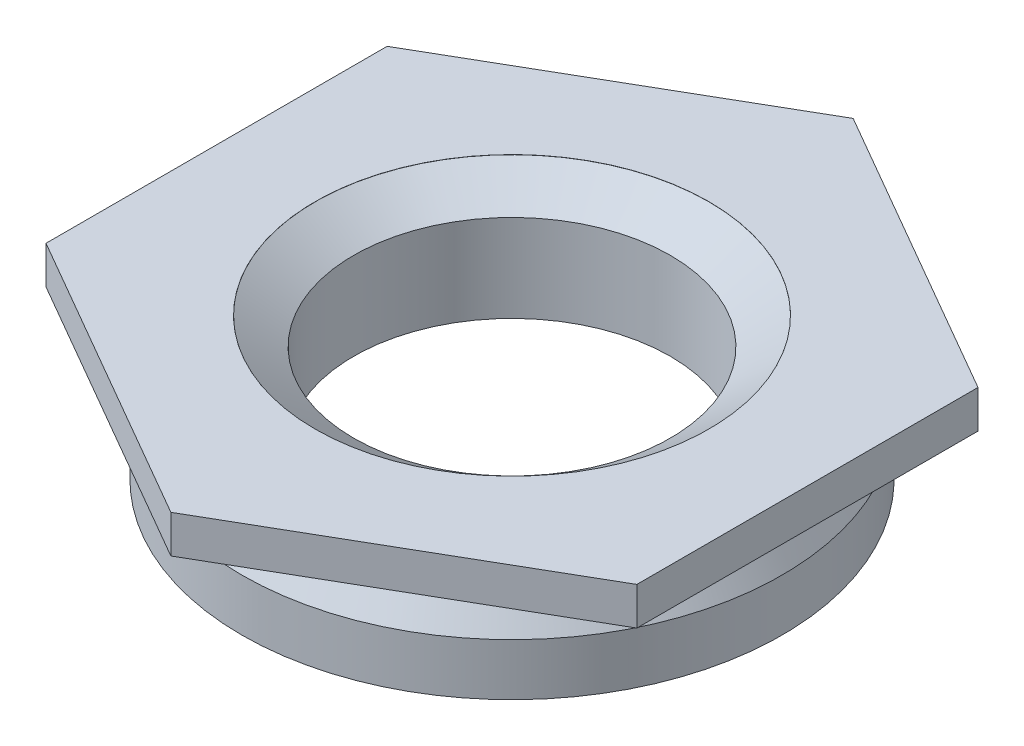
ISO-10303-21;
HEADER;
FILE_DESCRIPTION(('STEP AP214'),'2;1');
FILE_NAME('part.step','',(''),(''),'','','');
FILE_SCHEMA(('AUTOMOTIVE_DESIGN { 1 0 10303 214 1 1 1 1 }'));
ENDSEC;
DATA;
#1=APPLICATION_CONTEXT('core data for automotive mechanical design processes');
#2=APPLICATION_PROTOCOL_DEFINITION('international standard','automotive_design',2000,#1);
#3=PRODUCT_CONTEXT('',#1,'mechanical');
#4=PRODUCT('Part','Part','',(#3));
#5=PRODUCT_RELATED_PRODUCT_CATEGORY('part','',(#4));
#6=PRODUCT_DEFINITION_FORMATION('','',#4);
#7=PRODUCT_DEFINITION_CONTEXT('part definition',#1,'design');
#8=PRODUCT_DEFINITION('design','',#6,#7);
#9=PRODUCT_DEFINITION_SHAPE('','',#8);
#10=(LENGTH_UNIT() NAMED_UNIT(*) SI_UNIT(.MILLI.,.METRE.));
#11=(NAMED_UNIT(*) PLANE_ANGLE_UNIT() SI_UNIT($,.RADIAN.));
#12=(NAMED_UNIT(*) SI_UNIT($,.STERADIAN.) SOLID_ANGLE_UNIT());
#13=UNCERTAINTY_MEASURE_WITH_UNIT(LENGTH_MEASURE(1.E-05),#10,'distance_accuracy_value','');
#14=(GEOMETRIC_REPRESENTATION_CONTEXT(3) GLOBAL_UNCERTAINTY_ASSIGNED_CONTEXT((#13)) GLOBAL_UNIT_ASSIGNED_CONTEXT((#10,
#11,#12)) REPRESENTATION_CONTEXT('',''));
#15=CARTESIAN_POINT('',(0.,0.,0.));
#16=DIRECTION('',(0.,0.,1.));
#17=DIRECTION('',(1.,0.,0.));
#18=AXIS2_PLACEMENT_3D('',#15,#16,#17);
#19=CARTESIAN_POINT('',(4.04814136641425,0.,0.));
#20=DIRECTION('',(0.,-1.,0.));
#21=DIRECTION('',(0.,0.,-1.));
#22=AXIS2_PLACEMENT_3D('',#19,#20,#21);
#23=PLANE('',#22);
#24=CARTESIAN_POINT('',(0.,0.,0.));
#25=DIRECTION('',(0.,-1.,0.));
#26=DIRECTION('',(0.,0.,-1.));
#27=AXIS2_PLACEMENT_3D('',#24,#25,#26);
#28=CIRCLE('',#27,4.04814136641425);
#29=CARTESIAN_POINT('',(0.,0.,-4.04814136641425));
#30=VERTEX_POINT('',#29);
#31=EDGE_CURVE('E11',#30,#30,#28,.T.);
#32=ORIENTED_EDGE('',*,*,#31,.F.);
#33=EDGE_LOOP('',(#32));
#34=FACE_BOUND('',#33,.T.);
#35=DIRECTION('',(0.,0.,-1.));
#36=VECTOR('',#35,1.);
#37=CARTESIAN_POINT('',(4.7625,0.,-2.74963065701559));
#38=LINE('',#37,#36);
#39=CARTESIAN_POINT('',(4.7625,0.,2.74963065701559));
#40=VERTEX_POINT('',#39);
#41=CARTESIAN_POINT('',(4.7625,0.,-2.74963065701559));
#42=VERTEX_POINT('',#41);
#43=EDGE_CURVE('E103',#40,#42,#38,.T.);
#44=ORIENTED_EDGE('',*,*,#43,.F.);
#45=DIRECTION('',(0.866025403784439,0.,-0.5));
#46=VECTOR('',#45,1.);
#47=CARTESIAN_POINT('',(4.7625,0.,2.74963065701559));
#48=LINE('',#47,#46);
#49=CARTESIAN_POINT('',(0.,0.,5.49926131403118));
#50=VERTEX_POINT('',#49);
#51=EDGE_CURVE('E48',#50,#40,#48,.T.);
#52=ORIENTED_EDGE('',*,*,#51,.F.);
#53=DIRECTION('',(0.866025403784439,0.,0.5));
#54=VECTOR('',#53,1.);
#55=CARTESIAN_POINT('',(0.,0.,5.49926131403118));
#56=LINE('',#55,#54);
#57=CARTESIAN_POINT('',(-4.7625,0.,2.74963065701559));
#58=VERTEX_POINT('',#57);
#59=EDGE_CURVE('E109',#58,#50,#56,.T.);
#60=ORIENTED_EDGE('',*,*,#59,.F.);
#61=DIRECTION('',(0.,0.,1.));
#62=VECTOR('',#61,1.);
#63=CARTESIAN_POINT('',(-4.7625,0.,2.74963065701559));
#64=LINE('',#63,#62);
#65=CARTESIAN_POINT('',(-4.7625,0.,-2.74963065701559));
#66=VERTEX_POINT('',#65);
#67=EDGE_CURVE('E107',#66,#58,#64,.T.);
#68=ORIENTED_EDGE('',*,*,#67,.F.);
#69=DIRECTION('',(-0.866025403784439,0.,0.5));
#70=VECTOR('',#69,1.);
#71=CARTESIAN_POINT('',(-4.7625,0.,-2.74963065701559));
#72=LINE('',#71,#70);
#73=CARTESIAN_POINT('',(0.,0.,-5.49926131403118));
#74=VERTEX_POINT('',#73);
#75=EDGE_CURVE('E90',#74,#66,#72,.T.);
#76=ORIENTED_EDGE('',*,*,#75,.F.);
#77=DIRECTION('',(-0.866025403784439,0.,-0.5));
#78=VECTOR('',#77,1.);
#79=CARTESIAN_POINT('',(0.,0.,-5.49926131403118));
#80=LINE('',#79,#78);
#81=EDGE_CURVE('E98',#42,#74,#80,.T.);
#82=ORIENTED_EDGE('',*,*,#81,.F.);
#83=EDGE_LOOP('',(#44,#52,#60,#68,#76,#82));
#84=FACE_BOUND('',#83,.T.);
#85=ADVANCED_FACE('F32',(#34,#84),#23,.T.);
#86=CARTESIAN_POINT('',(5.5118,0.6096,0.));
#87=DIRECTION('',(0.,1.,0.));
#88=DIRECTION('',(0.,0.,1.));
#89=AXIS2_PLACEMENT_3D('',#86,#87,#88);
#90=PLANE('',#89);
#91=CARTESIAN_POINT('',(0.,0.6096,0.));
#92=DIRECTION('',(0.,1.,0.));
#93=DIRECTION('',(0.,0.,1.));
#94=AXIS2_PLACEMENT_3D('',#91,#92,#93);
#95=CIRCLE('',#94,3.175);
#96=CARTESIAN_POINT('',(0.,0.6096,3.175));
#97=VERTEX_POINT('',#96);
#98=EDGE_CURVE('E35',#97,#97,#95,.T.);
#99=ORIENTED_EDGE('',*,*,#98,.F.);
#100=EDGE_LOOP('',(#99));
#101=FACE_BOUND('',#100,.T.);
#102=DIRECTION('',(0.866025403784439,0.,0.5));
#103=VECTOR('',#102,1.);
#104=CARTESIAN_POINT('',(0.,0.6096,5.49926131403118));
#105=LINE('',#104,#103);
#106=CARTESIAN_POINT('',(-4.7625,0.6096,2.74963065701559));
#107=VERTEX_POINT('',#106);
#108=CARTESIAN_POINT('',(0.,0.6096,5.49926131403118));
#109=VERTEX_POINT('',#108);
#110=EDGE_CURVE('E127',#107,#109,#105,.T.);
#111=ORIENTED_EDGE('',*,*,#110,.T.);
#112=DIRECTION('',(0.866025403784439,0.,-0.5));
#113=VECTOR('',#112,1.);
#114=CARTESIAN_POINT('',(4.7625,0.6096,2.74963065701559));
#115=LINE('',#114,#113);
#116=CARTESIAN_POINT('',(4.7625,0.6096,2.74963065701559));
#117=VERTEX_POINT('',#116);
#118=EDGE_CURVE('E116',#109,#117,#115,.T.);
#119=ORIENTED_EDGE('',*,*,#118,.T.);
#120=DIRECTION('',(0.,0.,-1.));
#121=VECTOR('',#120,1.);
#122=CARTESIAN_POINT('',(4.7625,0.6096,-2.74963065701559));
#123=LINE('',#122,#121);
#124=CARTESIAN_POINT('',(4.7625,0.6096,-2.74963065701559));
#125=VERTEX_POINT('',#124);
#126=EDGE_CURVE('E119',#117,#125,#123,.T.);
#127=ORIENTED_EDGE('',*,*,#126,.T.);
#128=DIRECTION('',(-0.866025403784439,0.,-0.5));
#129=VECTOR('',#128,1.);
#130=CARTESIAN_POINT('',(0.,0.6096,-5.49926131403118));
#131=LINE('',#130,#129);
#132=CARTESIAN_POINT('',(0.,0.6096,-5.49926131403118));
#133=VERTEX_POINT('',#132);
#134=EDGE_CURVE('E56',#125,#133,#131,.T.);
#135=ORIENTED_EDGE('',*,*,#134,.T.);
#136=DIRECTION('',(-0.866025403784439,0.,0.5));
#137=VECTOR('',#136,1.);
#138=CARTESIAN_POINT('',(-4.7625,0.6096,-2.74963065701559));
#139=LINE('',#138,#137);
#140=CARTESIAN_POINT('',(-4.7625,0.6096,-2.74963065701559));
#141=VERTEX_POINT('',#140);
#142=EDGE_CURVE('E93',#133,#141,#139,.T.);
#143=ORIENTED_EDGE('',*,*,#142,.T.);
#144=DIRECTION('',(0.,0.,1.));
#145=VECTOR('',#144,1.);
#146=CARTESIAN_POINT('',(-4.7625,0.6096,2.74963065701559));
#147=LINE('',#146,#145);
#148=EDGE_CURVE('E124',#141,#107,#147,.T.);
#149=ORIENTED_EDGE('',*,*,#148,.T.);
#150=EDGE_LOOP('',(#111,#119,#127,#135,#143,#149));
#151=FACE_BOUND('',#150,.T.);
#152=ADVANCED_FACE('F182',(#101,#151),#90,.T.);
#153=CARTESIAN_POINT('',(0.,0.,0.));
#154=DIRECTION('',(0.,-1.,0.));
#155=DIRECTION('',(0.,0.,-1.));
#156=AXIS2_PLACEMENT_3D('',#153,#154,#155);
#157=CYLINDRICAL_SURFACE('',#156,4.04814136641425);
#158=ORIENTED_EDGE('',*,*,#31,.T.);
#159=EDGE_LOOP('',(#158));
#160=FACE_BOUND('',#159,.T.);
#161=CARTESIAN_POINT('',(0.,-0.3048,0.));
#162=DIRECTION('',(0.,-1.,0.));
#163=DIRECTION('',(0.,0.,-1.));
#164=AXIS2_PLACEMENT_3D('',#161,#162,#163);
#165=CIRCLE('',#164,4.04814136641425);
#166=CARTESIAN_POINT('',(0.,-0.3048,-4.04814136641425));
#167=VERTEX_POINT('',#166);
#168=EDGE_CURVE('E40',#167,#167,#165,.T.);
#169=ORIENTED_EDGE('',*,*,#168,.F.);
#170=EDGE_LOOP('',(#169));
#171=FACE_BOUND('',#170,.T.);
#172=ADVANCED_FACE('F178',(#160,#171),#157,.T.);
#173=CARTESIAN_POINT('',(0.,-0.8382,0.));
#174=DIRECTION('',(0.,-1.,0.));
#175=DIRECTION('',(0.,0.,-1.));
#176=AXIS2_PLACEMENT_3D('',#173,#174,#175);
#177=CONICAL_SURFACE('',#176,4.3561,0.523598775598303);
#178=ORIENTED_EDGE('',*,*,#168,.T.);
#179=EDGE_LOOP('',(#178));
#180=FACE_BOUND('',#179,.T.);
#181=CARTESIAN_POINT('',(0.,-0.8382,0.));
#182=DIRECTION('',(0.,-1.,0.));
#183=DIRECTION('',(0.,0.,-1.));
#184=AXIS2_PLACEMENT_3D('',#181,#182,#183);
#185=CIRCLE('',#184,4.3561);
#186=CARTESIAN_POINT('',(0.,-0.8382,-4.3561));
#187=VERTEX_POINT('',#186);
#188=EDGE_CURVE('E153',#187,#187,#185,.T.);
#189=ORIENTED_EDGE('',*,*,#188,.F.);
#190=EDGE_LOOP('',(#189));
#191=FACE_BOUND('',#190,.T.);
#192=ADVANCED_FACE('F172',(#180,#191),#177,.T.);
#193=CARTESIAN_POINT('',(0.,0.,0.));
#194=DIRECTION('',(0.,-1.,0.));
#195=DIRECTION('',(0.,0.,-1.));
#196=AXIS2_PLACEMENT_3D('',#193,#194,#195);
#197=CYLINDRICAL_SURFACE('',#196,4.3561);
#198=ORIENTED_EDGE('',*,*,#188,.T.);
#199=EDGE_LOOP('',(#198));
#200=FACE_BOUND('',#199,.T.);
#201=CARTESIAN_POINT('',(0.,-1.6764,0.));
#202=DIRECTION('',(0.,-1.,0.));
#203=DIRECTION('',(0.,0.,-1.));
#204=AXIS2_PLACEMENT_3D('',#201,#202,#203);
#205=CIRCLE('',#204,4.3561);
#206=CARTESIAN_POINT('',(0.,-1.6764,-4.3561));
#207=VERTEX_POINT('',#206);
#208=EDGE_CURVE('E150',#207,#207,#205,.T.);
#209=ORIENTED_EDGE('',*,*,#208,.F.);
#210=EDGE_LOOP('',(#209));
#211=FACE_BOUND('',#210,.T.);
#212=ADVANCED_FACE('F167',(#200,#211),#197,.T.);
#213=CARTESIAN_POINT('',(2.5527,-1.6764,0.));
#214=DIRECTION('',(0.,-1.,0.));
#215=DIRECTION('',(0.,0.,-1.));
#216=AXIS2_PLACEMENT_3D('',#213,#214,#215);
#217=PLANE('',#216);
#218=CARTESIAN_POINT('',(0.,-1.6764,0.));
#219=DIRECTION('',(0.,-1.,0.));
#220=DIRECTION('',(0.,0.,-1.));
#221=AXIS2_PLACEMENT_3D('',#218,#219,#220);
#222=CIRCLE('',#221,3.175);
#223=CARTESIAN_POINT('',(0.,-1.6764,-3.175));
#224=VERTEX_POINT('',#223);
#225=EDGE_CURVE('E149',#224,#224,#222,.T.);
#226=ORIENTED_EDGE('',*,*,#225,.F.);
#227=EDGE_LOOP('',(#226));
#228=FACE_BOUND('',#227,.T.);
#229=ORIENTED_EDGE('',*,*,#208,.T.);
#230=EDGE_LOOP('',(#229));
#231=FACE_BOUND('',#230,.T.);
#232=ADVANCED_FACE('F163',(#228,#231),#217,.T.);
#233=CARTESIAN_POINT('',(0.,0.,0.));
#234=DIRECTION('',(0.,-1.,0.));
#235=DIRECTION('',(0.,0.,-1.));
#236=AXIS2_PLACEMENT_3D('',#233,#234,#235);
#237=CYLINDRICAL_SURFACE('',#236,2.5527);
#238=CARTESIAN_POINT('',(0.,0.17148269239784,0.));
#239=DIRECTION('',(0.,-1.,0.));
#240=DIRECTION('',(0.,0.,-1.));
#241=AXIS2_PLACEMENT_3D('',#238,#239,#240);
#242=CIRCLE('',#241,2.5527);
#243=CARTESIAN_POINT('',(0.,0.17148269239784,-2.5527));
#244=VERTEX_POINT('',#243);
#245=EDGE_CURVE('E140',#244,#244,#242,.T.);
#246=ORIENTED_EDGE('',*,*,#245,.F.);
#247=EDGE_LOOP('',(#246));
#248=FACE_BOUND('',#247,.T.);
#249=CARTESIAN_POINT('',(0.,-1.23828269239784,0.));
#250=DIRECTION('',(0.,-1.,0.));
#251=DIRECTION('',(0.,0.,-1.));
#252=AXIS2_PLACEMENT_3D('',#249,#250,#251);
#253=CIRCLE('',#252,2.5527);
#254=CARTESIAN_POINT('',(0.,-1.23828269239784,-2.5527));
#255=VERTEX_POINT('',#254);
#256=EDGE_CURVE('E146',#255,#255,#253,.T.);
#257=ORIENTED_EDGE('',*,*,#256,.T.);
#258=EDGE_LOOP('',(#257));
#259=FACE_BOUND('',#258,.T.);
#260=ADVANCED_FACE('F166',(#248,#259),#237,.F.);
#261=CARTESIAN_POINT('',(0.,-1.67386,0.));
#262=DIRECTION('',(0.,-1.,0.));
#263=DIRECTION('',(0.,0.,-1.));
#264=AXIS2_PLACEMENT_3D('',#261,#262,#263);
#265=CONICAL_SURFACE('',#264,3.175,0.960105621522087);
#266=ORIENTED_EDGE('',*,*,#256,.F.);
#267=EDGE_LOOP('',(#266));
#268=FACE_BOUND('',#267,.T.);
#269=CARTESIAN_POINT('',(0.,-1.67386,0.));
#270=DIRECTION('',(0.,-1.,0.));
#271=DIRECTION('',(0.,0.,-1.));
#272=AXIS2_PLACEMENT_3D('',#269,#270,#271);
#273=CIRCLE('',#272,3.175);
#274=CARTESIAN_POINT('',(0.,-1.67386,-3.175));
#275=VERTEX_POINT('',#274);
#276=EDGE_CURVE('E143',#275,#275,#273,.T.);
#277=ORIENTED_EDGE('',*,*,#276,.T.);
#278=EDGE_LOOP('',(#277));
#279=FACE_BOUND('',#278,.T.);
#280=ADVANCED_FACE('F223',(#268,#279),#265,.F.);
#281=CARTESIAN_POINT('',(0.,-2.54,0.));
#282=DIRECTION('',(0.,-1.,0.));
#283=DIRECTION('',(0.,0.,-1.));
#284=AXIS2_PLACEMENT_3D('',#281,#282,#283);
#285=CYLINDRICAL_SURFACE('',#284,3.175);
#286=ORIENTED_EDGE('',*,*,#225,.T.);
#287=EDGE_LOOP('',(#286));
#288=FACE_BOUND('',#287,.T.);
#289=ORIENTED_EDGE('',*,*,#276,.F.);
#290=EDGE_LOOP('',(#289));
#291=FACE_BOUND('',#290,.T.);
#292=ADVANCED_FACE('F160',(#288,#291),#285,.F.);
#293=CARTESIAN_POINT('',(0.,-2.54,0.));
#294=DIRECTION('',(0.,-1.,0.));
#295=DIRECTION('',(0.,0.,-1.));
#296=AXIS2_PLACEMENT_3D('',#293,#294,#295);
#297=CYLINDRICAL_SURFACE('',#296,3.175);
#298=ORIENTED_EDGE('',*,*,#98,.T.);
#299=EDGE_LOOP('',(#298));
#300=FACE_BOUND('',#299,.T.);
#301=CARTESIAN_POINT('',(0.,0.607059999999999,0.));
#302=DIRECTION('',(0.,-1.,0.));
#303=DIRECTION('',(0.,0.,-1.));
#304=AXIS2_PLACEMENT_3D('',#301,#302,#303);
#305=CIRCLE('',#304,3.175);
#306=CARTESIAN_POINT('',(0.,0.607059999999999,-3.175));
#307=VERTEX_POINT('',#306);
#308=EDGE_CURVE('E132',#307,#307,#305,.T.);
#309=ORIENTED_EDGE('',*,*,#308,.T.);
#310=EDGE_LOOP('',(#309));
#311=FACE_BOUND('',#310,.T.);
#312=ADVANCED_FACE('F242',(#300,#311),#297,.F.);
#313=CARTESIAN_POINT('',(0.,0.17148269239784,0.));
#314=DIRECTION('',(0.,1.,0.));
#315=DIRECTION('',(0.,0.,1.));
#316=AXIS2_PLACEMENT_3D('',#313,#314,#315);
#317=CONICAL_SURFACE('',#316,2.5527,0.960105621522086);
#318=ORIENTED_EDGE('',*,*,#308,.F.);
#319=EDGE_LOOP('',(#318));
#320=FACE_BOUND('',#319,.T.);
#321=ORIENTED_EDGE('',*,*,#245,.T.);
#322=EDGE_LOOP('',(#321));
#323=FACE_BOUND('',#322,.T.);
#324=ADVANCED_FACE('F251',(#320,#323),#317,.F.);
#325=CARTESIAN_POINT('',(4.7625,0.,2.74963065701559));
#326=DIRECTION('',(0.5,0.,0.866025403784439));
#327=DIRECTION('',(0.866025403784439,0.,-0.5));
#328=AXIS2_PLACEMENT_3D('',#325,#326,#327);
#329=PLANE('',#328);
#330=ORIENTED_EDGE('',*,*,#118,.F.);
#331=DIRECTION('',(0.,1.,0.));
#332=VECTOR('',#331,1.);
#333=CARTESIAN_POINT('',(0.,0.,5.49926131403118));
#334=LINE('',#333,#332);
#335=EDGE_CURVE('E130',#50,#109,#334,.T.);
#336=ORIENTED_EDGE('',*,*,#335,.F.);
#337=ORIENTED_EDGE('',*,*,#51,.T.);
#338=DIRECTION('',(0.,1.,0.));
#339=VECTOR('',#338,1.);
#340=CARTESIAN_POINT('',(4.7625,0.,2.74963065701559));
#341=LINE('',#340,#339);
#342=EDGE_CURVE('E115',#40,#117,#341,.T.);
#343=ORIENTED_EDGE('',*,*,#342,.T.);
#344=EDGE_LOOP('',(#330,#336,#337,#343));
#345=FACE_BOUND('',#344,.T.);
#346=ADVANCED_FACE('F260',(#345),#329,.T.);
#347=CARTESIAN_POINT('',(0.,0.,5.49926131403118));
#348=DIRECTION('',(-0.5,0.,0.866025403784439));
#349=DIRECTION('',(0.866025403784439,0.,0.5));
#350=AXIS2_PLACEMENT_3D('',#347,#348,#349);
#351=PLANE('',#350);
#352=ORIENTED_EDGE('',*,*,#110,.F.);
#353=DIRECTION('',(0.,1.,0.));
#354=VECTOR('',#353,1.);
#355=CARTESIAN_POINT('',(-4.7625,0.,2.74963065701559));
#356=LINE('',#355,#354);
#357=EDGE_CURVE('E133',#58,#107,#356,.T.);
#358=ORIENTED_EDGE('',*,*,#357,.F.);
#359=ORIENTED_EDGE('',*,*,#59,.T.);
#360=ORIENTED_EDGE('',*,*,#335,.T.);
#361=EDGE_LOOP('',(#352,#358,#359,#360));
#362=FACE_BOUND('',#361,.T.);
#363=ADVANCED_FACE('F279',(#362),#351,.T.);
#364=CARTESIAN_POINT('',(-4.7625,0.,2.74963065701559));
#365=DIRECTION('',(-1.,0.,0.));
#366=DIRECTION('',(0.,0.,1.));
#367=AXIS2_PLACEMENT_3D('',#364,#365,#366);
#368=PLANE('',#367);
#369=ORIENTED_EDGE('',*,*,#148,.F.);
#370=DIRECTION('',(0.,1.,0.));
#371=VECTOR('',#370,1.);
#372=CARTESIAN_POINT('',(-4.7625,0.,-2.74963065701559));
#373=LINE('',#372,#371);
#374=EDGE_CURVE('E94',#66,#141,#373,.T.);
#375=ORIENTED_EDGE('',*,*,#374,.F.);
#376=ORIENTED_EDGE('',*,*,#67,.T.);
#377=ORIENTED_EDGE('',*,*,#357,.T.);
#378=EDGE_LOOP('',(#369,#375,#376,#377));
#379=FACE_BOUND('',#378,.T.);
#380=ADVANCED_FACE('F288',(#379),#368,.T.);
#381=CARTESIAN_POINT('',(-4.7625,0.,-2.74963065701559));
#382=DIRECTION('',(-0.5,0.,-0.866025403784439));
#383=DIRECTION('',(-0.866025403784439,0.,0.5));
#384=AXIS2_PLACEMENT_3D('',#381,#382,#383);
#385=PLANE('',#384);
#386=ORIENTED_EDGE('',*,*,#142,.F.);
#387=DIRECTION('',(0.,1.,0.));
#388=VECTOR('',#387,1.);
#389=CARTESIAN_POINT('',(0.,0.,-5.49926131403118));
#390=LINE('',#389,#388);
#391=EDGE_CURVE('E86',#74,#133,#390,.T.);
#392=ORIENTED_EDGE('',*,*,#391,.F.);
#393=ORIENTED_EDGE('',*,*,#75,.T.);
#394=ORIENTED_EDGE('',*,*,#374,.T.);
#395=EDGE_LOOP('',(#386,#392,#393,#394));
#396=FACE_BOUND('',#395,.T.);
#397=ADVANCED_FACE('F88',(#396),#385,.T.);
#398=CARTESIAN_POINT('',(0.,0.,-5.49926131403118));
#399=DIRECTION('',(0.5,0.,-0.866025403784439));
#400=DIRECTION('',(-0.866025403784439,0.,-0.5));
#401=AXIS2_PLACEMENT_3D('',#398,#399,#400);
#402=PLANE('',#401);
#403=ORIENTED_EDGE('',*,*,#134,.F.);
#404=DIRECTION('',(0.,1.,0.));
#405=VECTOR('',#404,1.);
#406=CARTESIAN_POINT('',(4.7625,0.,-2.74963065701559));
#407=LINE('',#406,#405);
#408=EDGE_CURVE('E95',#42,#125,#407,.T.);
#409=ORIENTED_EDGE('',*,*,#408,.F.);
#410=ORIENTED_EDGE('',*,*,#81,.T.);
#411=ORIENTED_EDGE('',*,*,#391,.T.);
#412=EDGE_LOOP('',(#403,#409,#410,#411));
#413=FACE_BOUND('',#412,.T.);
#414=ADVANCED_FACE('F99',(#413),#402,.T.);
#415=CARTESIAN_POINT('',(4.7625,0.,-2.74963065701559));
#416=DIRECTION('',(1.,0.,0.));
#417=DIRECTION('',(0.,0.,-1.));
#418=AXIS2_PLACEMENT_3D('',#415,#416,#417);
#419=PLANE('',#418);
#420=ORIENTED_EDGE('',*,*,#126,.F.);
#421=ORIENTED_EDGE('',*,*,#342,.F.);
#422=ORIENTED_EDGE('',*,*,#43,.T.);
#423=ORIENTED_EDGE('',*,*,#408,.T.);
#424=EDGE_LOOP('',(#420,#421,#422,#423));
#425=FACE_BOUND('',#424,.T.);
#426=ADVANCED_FACE('F315',(#425),#419,.T.);
#427=CLOSED_SHELL('',(#85,#152,#172,#192,#212,#232,#260,#280,#292,#312,#324,#346,#363,#380,#397,
#414,#426));
#428=MANIFOLD_SOLID_BREP('B2',#427);
#429=ADVANCED_BREP_SHAPE_REPRESENTATION('',(#18,#428),#14);
#430=SHAPE_DEFINITION_REPRESENTATION(#9,#429);
ENDSEC;
END-ISO-10303-21;
